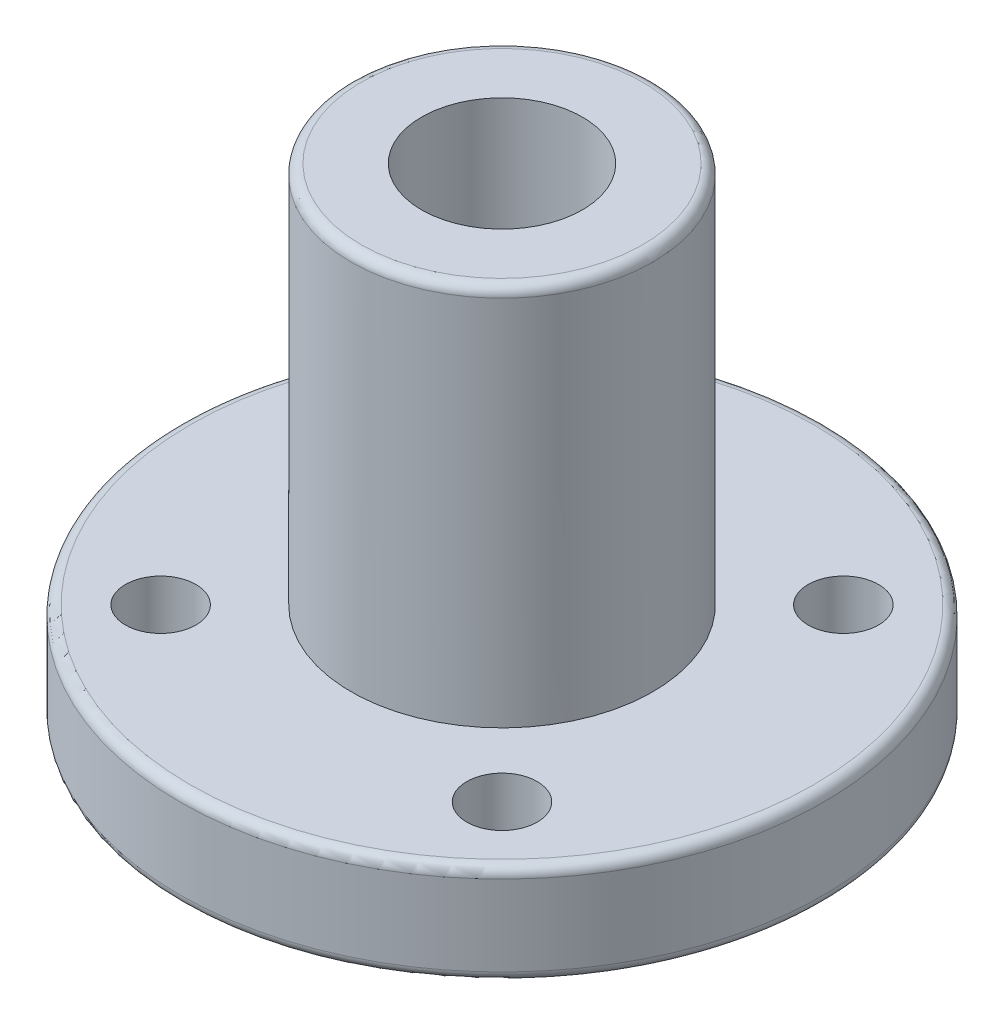
ISO-10303-21;
HEADER;
FILE_DESCRIPTION(('STEP AP214'),'2;1');
FILE_NAME('part.step','',(''),(''),'','','');
FILE_SCHEMA(('AUTOMOTIVE_DESIGN { 1 0 10303 214 1 1 1 1 }'));
ENDSEC;
DATA;
#1=APPLICATION_CONTEXT('core data for automotive mechanical design processes');
#2=APPLICATION_PROTOCOL_DEFINITION('international standard','automotive_design',2000,#1);
#3=PRODUCT_CONTEXT('',#1,'mechanical');
#4=PRODUCT('Part','Part','',(#3));
#5=PRODUCT_RELATED_PRODUCT_CATEGORY('part','',(#4));
#6=PRODUCT_DEFINITION_FORMATION('','',#4);
#7=PRODUCT_DEFINITION_CONTEXT('part definition',#1,'design');
#8=PRODUCT_DEFINITION('design','',#6,#7);
#9=PRODUCT_DEFINITION_SHAPE('','',#8);
#10=(LENGTH_UNIT() NAMED_UNIT(*) SI_UNIT(.MILLI.,.METRE.));
#11=(NAMED_UNIT(*) PLANE_ANGLE_UNIT() SI_UNIT($,.RADIAN.));
#12=(NAMED_UNIT(*) SI_UNIT($,.STERADIAN.) SOLID_ANGLE_UNIT());
#13=UNCERTAINTY_MEASURE_WITH_UNIT(LENGTH_MEASURE(1.E-05),#10,'distance_accuracy_value','');
#14=(GEOMETRIC_REPRESENTATION_CONTEXT(3) GLOBAL_UNCERTAINTY_ASSIGNED_CONTEXT((#13)) GLOBAL_UNIT_ASSIGNED_CONTEXT((#10,
#11,#12)) REPRESENTATION_CONTEXT('',''));
#15=CARTESIAN_POINT('',(0.,0.,0.));
#16=DIRECTION('',(0.,0.,1.));
#17=DIRECTION('',(1.,0.,0.));
#18=AXIS2_PLACEMENT_3D('',#15,#16,#17);
#19=CARTESIAN_POINT('',(0.,24.,0.));
#20=DIRECTION('',(0.,-1.,0.));
#21=DIRECTION('',(0.,0.,-1.));
#22=AXIS2_PLACEMENT_3D('',#19,#20,#21);
#23=CYLINDRICAL_SURFACE('',#22,7.5);
#24=CARTESIAN_POINT('',(0.,23.5,0.));
#25=DIRECTION('',(0.,1.,0.));
#26=DIRECTION('',(0.,0.,1.));
#27=AXIS2_PLACEMENT_3D('',#24,#25,#26);
#28=CIRCLE('',#27,7.5);
#29=CARTESIAN_POINT('',(0.,23.5,7.5));
#30=VERTEX_POINT('',#29);
#31=EDGE_CURVE('E40',#30,#30,#28,.F.);
#32=ORIENTED_EDGE('',*,*,#31,.T.);
#33=EDGE_LOOP('',(#32));
#34=FACE_BOUND('',#33,.T.);
#35=CARTESIAN_POINT('',(0.,5.,0.));
#36=DIRECTION('',(0.,-1.,0.));
#37=DIRECTION('',(0.,0.,-1.));
#38=AXIS2_PLACEMENT_3D('',#35,#36,#37);
#39=CIRCLE('',#38,7.5);
#40=CARTESIAN_POINT('',(0.,5.,-7.5));
#41=VERTEX_POINT('',#40);
#42=EDGE_CURVE('E59',#41,#41,#39,.T.);
#43=ORIENTED_EDGE('',*,*,#42,.F.);
#44=EDGE_LOOP('',(#43));
#45=FACE_BOUND('',#44,.T.);
#46=ADVANCED_FACE('F33',(#34,#45),#23,.T.);
#47=CARTESIAN_POINT('',(0.,24.,0.));
#48=DIRECTION('',(0.,1.,0.));
#49=DIRECTION('',(0.,0.,1.));
#50=AXIS2_PLACEMENT_3D('',#47,#48,#49);
#51=PLANE('',#50);
#52=CARTESIAN_POINT('',(0.,24.,0.));
#53=DIRECTION('',(0.,1.,0.));
#54=DIRECTION('',(0.,0.,1.));
#55=AXIS2_PLACEMENT_3D('',#52,#53,#54);
#56=CIRCLE('',#55,7.);
#57=CARTESIAN_POINT('',(0.,24.,7.));
#58=VERTEX_POINT('',#57);
#59=EDGE_CURVE('E44',#58,#58,#56,.T.);
#60=ORIENTED_EDGE('',*,*,#59,.T.);
#61=EDGE_LOOP('',(#60));
#62=FACE_BOUND('',#61,.T.);
#63=CARTESIAN_POINT('',(0.,24.,0.));
#64=DIRECTION('',(0.,1.,0.));
#65=DIRECTION('',(0.,0.,1.));
#66=AXIS2_PLACEMENT_3D('',#63,#64,#65);
#67=CIRCLE('',#66,4.);
#68=CARTESIAN_POINT('',(0.,24.,4.));
#69=VERTEX_POINT('',#68);
#70=EDGE_CURVE('E62',#69,#69,#67,.T.);
#71=ORIENTED_EDGE('',*,*,#70,.F.);
#72=EDGE_LOOP('',(#71));
#73=FACE_BOUND('',#72,.T.);
#74=ADVANCED_FACE('F108',(#62,#73),#51,.T.);
#75=CARTESIAN_POINT('',(0.,0.,0.));
#76=DIRECTION('',(0.,1.,0.));
#77=DIRECTION('',(0.,0.,1.));
#78=AXIS2_PLACEMENT_3D('',#75,#76,#77);
#79=PLANE('',#78);
#80=CARTESIAN_POINT('',(0.,0.,0.));
#81=DIRECTION('',(0.,1.,0.));
#82=DIRECTION('',(0.,0.,1.));
#83=AXIS2_PLACEMENT_3D('',#80,#81,#82);
#84=CIRCLE('',#83,15.5);
#85=CARTESIAN_POINT('',(0.,0.,15.5));
#86=VERTEX_POINT('',#85);
#87=EDGE_CURVE('E56',#86,#86,#84,.F.);
#88=ORIENTED_EDGE('',*,*,#87,.T.);
#89=EDGE_LOOP('',(#88));
#90=FACE_BOUND('',#89,.T.);
#91=CARTESIAN_POINT('',(0.,0.,0.));
#92=DIRECTION('',(0.,1.,0.));
#93=DIRECTION('',(0.,0.,1.));
#94=AXIS2_PLACEMENT_3D('',#91,#92,#93);
#95=CIRCLE('',#94,4.);
#96=CARTESIAN_POINT('',(0.,0.,4.));
#97=VERTEX_POINT('',#96);
#98=EDGE_CURVE('E63',#97,#97,#95,.T.);
#99=ORIENTED_EDGE('',*,*,#98,.T.);
#100=EDGE_LOOP('',(#99));
#101=FACE_BOUND('',#100,.T.);
#102=CARTESIAN_POINT('',(8.48528137423855,0.,-8.48528137423859));
#103=DIRECTION('',(0.,-1.,0.));
#104=DIRECTION('',(0.,0.,1.));
#105=AXIS2_PLACEMENT_3D('',#102,#103,#104);
#106=CIRCLE('',#105,1.75);
#107=CARTESIAN_POINT('',(8.48528137423855,0.,-6.73528137423859));
#108=VERTEX_POINT('',#107);
#109=EDGE_CURVE('E87',#108,#108,#106,.T.);
#110=ORIENTED_EDGE('',*,*,#109,.F.);
#111=EDGE_LOOP('',(#110));
#112=FACE_BOUND('',#111,.T.);
#113=CARTESIAN_POINT('',(-8.48528137423855,0.,-8.48528137423859));
#114=DIRECTION('',(0.,-1.,0.));
#115=DIRECTION('',(0.,0.,-1.));
#116=AXIS2_PLACEMENT_3D('',#113,#114,#115);
#117=CIRCLE('',#116,1.75);
#118=CARTESIAN_POINT('',(-8.48528137423855,0.,-10.2352813742386));
#119=VERTEX_POINT('',#118);
#120=EDGE_CURVE('E81',#119,#119,#117,.T.);
#121=ORIENTED_EDGE('',*,*,#120,.F.);
#122=EDGE_LOOP('',(#121));
#123=FACE_BOUND('',#122,.T.);
#124=CARTESIAN_POINT('',(-8.48528137423855,0.,8.48528137423859));
#125=DIRECTION('',(0.,-1.,0.));
#126=DIRECTION('',(0.,0.,1.));
#127=AXIS2_PLACEMENT_3D('',#124,#125,#126);
#128=CIRCLE('',#127,1.75);
#129=CARTESIAN_POINT('',(-8.48528137423855,0.,10.2352813742386));
#130=VERTEX_POINT('',#129);
#131=EDGE_CURVE('E75',#130,#130,#128,.T.);
#132=ORIENTED_EDGE('',*,*,#131,.F.);
#133=EDGE_LOOP('',(#132));
#134=FACE_BOUND('',#133,.T.);
#135=CARTESIAN_POINT('',(8.48528137423855,0.,8.48528137423859));
#136=DIRECTION('',(0.,-1.,0.));
#137=DIRECTION('',(0.,0.,-1.));
#138=AXIS2_PLACEMENT_3D('',#135,#136,#137);
#139=CIRCLE('',#138,1.75);
#140=CARTESIAN_POINT('',(8.48528137423855,0.,6.73528137423859));
#141=VERTEX_POINT('',#140);
#142=EDGE_CURVE('E69',#141,#141,#139,.T.);
#143=ORIENTED_EDGE('',*,*,#142,.F.);
#144=EDGE_LOOP('',(#143));
#145=FACE_BOUND('',#144,.T.);
#146=ADVANCED_FACE('F104',(#90,#101,#112,#123,#134,#145),#79,.F.);
#147=CARTESIAN_POINT('',(0.,24.,0.));
#148=DIRECTION('',(0.,-1.,0.));
#149=DIRECTION('',(0.,0.,-1.));
#150=AXIS2_PLACEMENT_3D('',#147,#148,#149);
#151=CYLINDRICAL_SURFACE('',#150,4.);
#152=ORIENTED_EDGE('',*,*,#70,.T.);
#153=EDGE_LOOP('',(#152));
#154=FACE_BOUND('',#153,.T.);
#155=ORIENTED_EDGE('',*,*,#98,.F.);
#156=EDGE_LOOP('',(#155));
#157=FACE_BOUND('',#156,.T.);
#158=ADVANCED_FACE('F107',(#154,#157),#151,.F.);
#159=CARTESIAN_POINT('',(0.,5.,0.));
#160=DIRECTION('',(0.,-1.,0.));
#161=DIRECTION('',(0.,0.,-1.));
#162=AXIS2_PLACEMENT_3D('',#159,#160,#161);
#163=CYLINDRICAL_SURFACE('',#162,16.);
#164=CARTESIAN_POINT('',(0.,0.5,0.));
#165=DIRECTION('',(0.,1.,0.));
#166=DIRECTION('',(0.,0.,1.));
#167=AXIS2_PLACEMENT_3D('',#164,#165,#166);
#168=CIRCLE('',#167,16.);
#169=CARTESIAN_POINT('',(0.,0.5,16.));
#170=VERTEX_POINT('',#169);
#171=EDGE_CURVE('E48',#170,#170,#168,.T.);
#172=ORIENTED_EDGE('',*,*,#171,.T.);
#173=EDGE_LOOP('',(#172));
#174=FACE_BOUND('',#173,.T.);
#175=CARTESIAN_POINT('',(0.,4.5,0.));
#176=DIRECTION('',(0.,-1.,0.));
#177=DIRECTION('',(0.,0.,-1.));
#178=AXIS2_PLACEMENT_3D('',#175,#176,#177);
#179=CIRCLE('',#178,16.);
#180=CARTESIAN_POINT('',(0.,4.5,-16.));
#181=VERTEX_POINT('',#180);
#182=EDGE_CURVE('E53',#181,#181,#179,.T.);
#183=ORIENTED_EDGE('',*,*,#182,.T.);
#184=EDGE_LOOP('',(#183));
#185=FACE_BOUND('',#184,.T.);
#186=ADVANCED_FACE('F128',(#174,#185),#163,.T.);
#187=CARTESIAN_POINT('',(0.,5.,0.));
#188=DIRECTION('',(0.,-1.,0.));
#189=DIRECTION('',(0.,0.,-1.));
#190=AXIS2_PLACEMENT_3D('',#187,#188,#189);
#191=PLANE('',#190);
#192=CARTESIAN_POINT('',(0.,5.,0.));
#193=DIRECTION('',(0.,-1.,0.));
#194=DIRECTION('',(0.,0.,-1.));
#195=AXIS2_PLACEMENT_3D('',#192,#193,#194);
#196=CIRCLE('',#195,15.5);
#197=CARTESIAN_POINT('',(0.,5.,-15.5));
#198=VERTEX_POINT('',#197);
#199=EDGE_CURVE('E10',#198,#198,#196,.F.);
#200=ORIENTED_EDGE('',*,*,#199,.T.);
#201=EDGE_LOOP('',(#200));
#202=FACE_BOUND('',#201,.T.);
#203=CARTESIAN_POINT('',(8.48528137423855,5.,-8.48528137423859));
#204=DIRECTION('',(0.,-1.,0.));
#205=DIRECTION('',(0.,0.,1.));
#206=AXIS2_PLACEMENT_3D('',#203,#204,#205);
#207=CIRCLE('',#206,1.75);
#208=CARTESIAN_POINT('',(8.48528137423855,5.,-6.73528137423859));
#209=VERTEX_POINT('',#208);
#210=EDGE_CURVE('E84',#209,#209,#207,.T.);
#211=ORIENTED_EDGE('',*,*,#210,.T.);
#212=EDGE_LOOP('',(#211));
#213=FACE_BOUND('',#212,.T.);
#214=CARTESIAN_POINT('',(-8.48528137423855,5.,-8.48528137423859));
#215=DIRECTION('',(0.,-1.,0.));
#216=DIRECTION('',(0.,0.,-1.));
#217=AXIS2_PLACEMENT_3D('',#214,#215,#216);
#218=CIRCLE('',#217,1.75);
#219=CARTESIAN_POINT('',(-8.48528137423855,5.,-10.2352813742386));
#220=VERTEX_POINT('',#219);
#221=EDGE_CURVE('E78',#220,#220,#218,.T.);
#222=ORIENTED_EDGE('',*,*,#221,.T.);
#223=EDGE_LOOP('',(#222));
#224=FACE_BOUND('',#223,.T.);
#225=CARTESIAN_POINT('',(-8.48528137423855,5.,8.48528137423859));
#226=DIRECTION('',(0.,-1.,0.));
#227=DIRECTION('',(0.,0.,1.));
#228=AXIS2_PLACEMENT_3D('',#225,#226,#227);
#229=CIRCLE('',#228,1.75);
#230=CARTESIAN_POINT('',(-8.48528137423855,5.,10.2352813742386));
#231=VERTEX_POINT('',#230);
#232=EDGE_CURVE('E72',#231,#231,#229,.T.);
#233=ORIENTED_EDGE('',*,*,#232,.T.);
#234=EDGE_LOOP('',(#233));
#235=FACE_BOUND('',#234,.T.);
#236=CARTESIAN_POINT('',(8.48528137423855,5.,8.48528137423859));
#237=DIRECTION('',(0.,-1.,0.));
#238=DIRECTION('',(0.,0.,-1.));
#239=AXIS2_PLACEMENT_3D('',#236,#237,#238);
#240=CIRCLE('',#239,1.75);
#241=CARTESIAN_POINT('',(8.48528137423855,5.,6.73528137423859));
#242=VERTEX_POINT('',#241);
#243=EDGE_CURVE('E66',#242,#242,#240,.T.);
#244=ORIENTED_EDGE('',*,*,#243,.T.);
#245=EDGE_LOOP('',(#244));
#246=FACE_BOUND('',#245,.T.);
#247=ORIENTED_EDGE('',*,*,#42,.T.);
#248=EDGE_LOOP('',(#247));
#249=FACE_BOUND('',#248,.T.);
#250=ADVANCED_FACE('F93',(#202,#213,#224,#235,#246,#249),#191,.F.);
#251=CARTESIAN_POINT('',(8.48528137423855,5.,8.48528137423859));
#252=DIRECTION('',(0.,-1.,0.));
#253=DIRECTION('',(0.,0.,-1.));
#254=AXIS2_PLACEMENT_3D('',#251,#252,#253);
#255=CYLINDRICAL_SURFACE('',#254,1.75);
#256=ORIENTED_EDGE('',*,*,#243,.F.);
#257=EDGE_LOOP('',(#256));
#258=FACE_BOUND('',#257,.T.);
#259=ORIENTED_EDGE('',*,*,#142,.T.);
#260=EDGE_LOOP('',(#259));
#261=FACE_BOUND('',#260,.T.);
#262=ADVANCED_FACE('F117',(#258,#261),#255,.F.);
#263=CARTESIAN_POINT('',(-8.48528137423855,5.,8.48528137423859));
#264=DIRECTION('',(0.,-1.,0.));
#265=DIRECTION('',(0.,0.,-1.));
#266=AXIS2_PLACEMENT_3D('',#263,#264,#265);
#267=CYLINDRICAL_SURFACE('',#266,1.75);
#268=ORIENTED_EDGE('',*,*,#232,.F.);
#269=EDGE_LOOP('',(#268));
#270=FACE_BOUND('',#269,.T.);
#271=ORIENTED_EDGE('',*,*,#131,.T.);
#272=EDGE_LOOP('',(#271));
#273=FACE_BOUND('',#272,.T.);
#274=ADVANCED_FACE('F119',(#270,#273),#267,.F.);
#275=CARTESIAN_POINT('',(-8.48528137423855,5.,-8.48528137423859));
#276=DIRECTION('',(0.,-1.,0.));
#277=DIRECTION('',(0.,0.,-1.));
#278=AXIS2_PLACEMENT_3D('',#275,#276,#277);
#279=CYLINDRICAL_SURFACE('',#278,1.75);
#280=ORIENTED_EDGE('',*,*,#221,.F.);
#281=EDGE_LOOP('',(#280));
#282=FACE_BOUND('',#281,.T.);
#283=ORIENTED_EDGE('',*,*,#120,.T.);
#284=EDGE_LOOP('',(#283));
#285=FACE_BOUND('',#284,.T.);
#286=ADVANCED_FACE('F100',(#282,#285),#279,.F.);
#287=CARTESIAN_POINT('',(8.48528137423855,5.,-8.48528137423859));
#288=DIRECTION('',(0.,-1.,0.));
#289=DIRECTION('',(0.,0.,-1.));
#290=AXIS2_PLACEMENT_3D('',#287,#288,#289);
#291=CYLINDRICAL_SURFACE('',#290,1.75);
#292=ORIENTED_EDGE('',*,*,#210,.F.);
#293=EDGE_LOOP('',(#292));
#294=FACE_BOUND('',#293,.T.);
#295=ORIENTED_EDGE('',*,*,#109,.T.);
#296=EDGE_LOOP('',(#295));
#297=FACE_BOUND('',#296,.T.);
#298=ADVANCED_FACE('F96',(#294,#297),#291,.F.);
#299=CARTESIAN_POINT('',(0.,0.5,0.));
#300=DIRECTION('',(0.,1.,0.));
#301=DIRECTION('',(0.,0.,1.));
#302=AXIS2_PLACEMENT_3D('',#299,#300,#301);
#303=TOROIDAL_SURFACE('',#302,15.5,0.5);
#304=ORIENTED_EDGE('',*,*,#171,.F.);
#305=EDGE_LOOP('',(#304));
#306=FACE_BOUND('',#305,.T.);
#307=ORIENTED_EDGE('',*,*,#87,.F.);
#308=EDGE_LOOP('',(#307));
#309=FACE_BOUND('',#308,.T.);
#310=ADVANCED_FACE('F99',(#306,#309),#303,.T.);
#311=CARTESIAN_POINT('',(0.,23.5,0.));
#312=DIRECTION('',(0.,1.,0.));
#313=DIRECTION('',(0.,0.,1.));
#314=AXIS2_PLACEMENT_3D('',#311,#312,#313);
#315=TOROIDAL_SURFACE('',#314,7.,0.5);
#316=ORIENTED_EDGE('',*,*,#31,.F.);
#317=EDGE_LOOP('',(#316));
#318=FACE_BOUND('',#317,.T.);
#319=ORIENTED_EDGE('',*,*,#59,.F.);
#320=EDGE_LOOP('',(#319));
#321=FACE_BOUND('',#320,.T.);
#322=ADVANCED_FACE('F141',(#318,#321),#315,.T.);
#323=CARTESIAN_POINT('',(0.,4.5,0.));
#324=DIRECTION('',(0.,-1.,0.));
#325=DIRECTION('',(0.,0.,-1.));
#326=AXIS2_PLACEMENT_3D('',#323,#324,#325);
#327=TOROIDAL_SURFACE('',#326,15.5,0.5);
#328=ORIENTED_EDGE('',*,*,#199,.F.);
#329=EDGE_LOOP('',(#328));
#330=FACE_BOUND('',#329,.T.);
#331=ORIENTED_EDGE('',*,*,#182,.F.);
#332=EDGE_LOOP('',(#331));
#333=FACE_BOUND('',#332,.T.);
#334=ADVANCED_FACE('F35',(#330,#333),#327,.T.);
#335=CLOSED_SHELL('',(#46,#74,#146,#158,#186,#250,#262,#274,#286,#298,#310,#322,#334));
#336=MANIFOLD_SOLID_BREP('B2',#335);
#337=ADVANCED_BREP_SHAPE_REPRESENTATION('',(#18,#336),#14);
#338=SHAPE_DEFINITION_REPRESENTATION(#9,#337);
ENDSEC;
END-ISO-10303-21;
